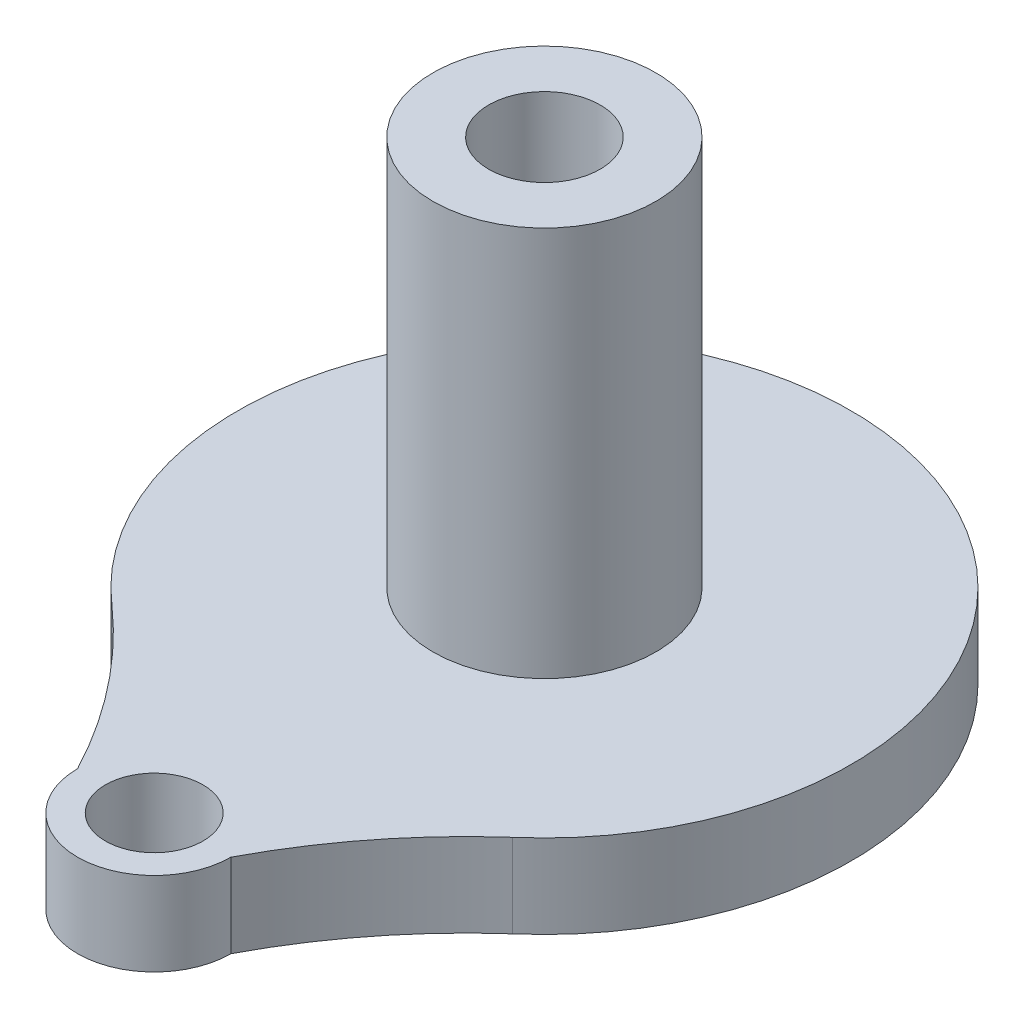
ISO-10303-21;
HEADER;
FILE_DESCRIPTION(('STEP AP214'),'2;1');
FILE_NAME('part.step','',(''),(''),'','','');
FILE_SCHEMA(('AUTOMOTIVE_DESIGN { 1 0 10303 214 1 1 1 1 }'));
ENDSEC;
DATA;
#1=APPLICATION_CONTEXT('core data for automotive mechanical design processes');
#2=APPLICATION_PROTOCOL_DEFINITION('international standard','automotive_design',2000,#1);
#3=PRODUCT_CONTEXT('',#1,'mechanical');
#4=PRODUCT('Part','Part','',(#3));
#5=PRODUCT_RELATED_PRODUCT_CATEGORY('part','',(#4));
#6=PRODUCT_DEFINITION_FORMATION('','',#4);
#7=PRODUCT_DEFINITION_CONTEXT('part definition',#1,'design');
#8=PRODUCT_DEFINITION('design','',#6,#7);
#9=PRODUCT_DEFINITION_SHAPE('','',#8);
#10=(LENGTH_UNIT() NAMED_UNIT(*) SI_UNIT(.MILLI.,.METRE.));
#11=(NAMED_UNIT(*) PLANE_ANGLE_UNIT() SI_UNIT($,.RADIAN.));
#12=(NAMED_UNIT(*) SI_UNIT($,.STERADIAN.) SOLID_ANGLE_UNIT());
#13=UNCERTAINTY_MEASURE_WITH_UNIT(LENGTH_MEASURE(1.E-05),#10,'distance_accuracy_value','');
#14=(GEOMETRIC_REPRESENTATION_CONTEXT(3) GLOBAL_UNCERTAINTY_ASSIGNED_CONTEXT((#13)) GLOBAL_UNIT_ASSIGNED_CONTEXT((#10,
#11,#12)) REPRESENTATION_CONTEXT('',''));
#15=CARTESIAN_POINT('',(0.,0.,0.));
#16=DIRECTION('',(0.,0.,1.));
#17=DIRECTION('',(1.,0.,0.));
#18=AXIS2_PLACEMENT_3D('',#15,#16,#17);
#19=CARTESIAN_POINT('',(0.,3.,0.));
#20=DIRECTION('',(0.,-1.,0.));
#21=DIRECTION('',(0.,0.,-1.));
#22=AXIS2_PLACEMENT_3D('',#19,#20,#21);
#23=CYLINDRICAL_SURFACE('',#22,11.);
#24=CARTESIAN_POINT('',(0.,0.,0.));
#25=DIRECTION('',(0.,1.,0.));
#26=DIRECTION('',(0.,0.,1.));
#27=AXIS2_PLACEMENT_3D('',#24,#25,#26);
#28=CIRCLE('',#27,11.);
#29=CARTESIAN_POINT('',(7.18573136738372,0.,8.3285811946452));
#30=VERTEX_POINT('',#29);
#31=CARTESIAN_POINT('',(-7.18573136738357,0.,8.32858119464533));
#32=VERTEX_POINT('',#31);
#33=EDGE_CURVE('E48',#30,#32,#28,.T.);
#34=ORIENTED_EDGE('',*,*,#33,.T.);
#35=DIRECTION('',(0.,-1.,0.));
#36=VECTOR('',#35,1.);
#37=CARTESIAN_POINT('',(-7.18573136738357,3.,8.32858119464533));
#38=LINE('',#37,#36);
#39=CARTESIAN_POINT('',(-7.18573136738357,3.,8.32858119464533));
#40=VERTEX_POINT('',#39);
#41=EDGE_CURVE('E61',#40,#32,#38,.T.);
#42=ORIENTED_EDGE('',*,*,#41,.F.);
#43=CARTESIAN_POINT('',(0.,3.,0.));
#44=DIRECTION('',(0.,1.,0.));
#45=DIRECTION('',(0.,0.,1.));
#46=AXIS2_PLACEMENT_3D('',#43,#44,#45);
#47=CIRCLE('',#46,11.);
#48=CARTESIAN_POINT('',(7.18573136738372,3.,8.3285811946452));
#49=VERTEX_POINT('',#48);
#50=EDGE_CURVE('E53',#49,#40,#47,.T.);
#51=ORIENTED_EDGE('',*,*,#50,.F.);
#52=DIRECTION('',(0.,-1.,0.));
#53=VECTOR('',#52,1.);
#54=CARTESIAN_POINT('',(7.18573136738372,3.,8.3285811946452));
#55=LINE('',#54,#53);
#56=EDGE_CURVE('E97',#49,#30,#55,.T.);
#57=ORIENTED_EDGE('',*,*,#56,.T.);
#58=EDGE_LOOP('',(#34,#42,#51,#57));
#59=FACE_BOUND('',#58,.T.);
#60=ADVANCED_FACE('F45',(#59),#23,.T.);
#61=CARTESIAN_POINT('',(0.,3.,0.));
#62=DIRECTION('',(0.,1.,0.));
#63=DIRECTION('',(0.,0.,1.));
#64=AXIS2_PLACEMENT_3D('',#61,#62,#63);
#65=PLANE('',#64);
#66=CARTESIAN_POINT('',(0.,3.,0.));
#67=DIRECTION('',(0.,1.,0.));
#68=DIRECTION('',(0.,0.,1.));
#69=AXIS2_PLACEMENT_3D('',#66,#67,#68);
#70=CIRCLE('',#69,4.);
#71=CARTESIAN_POINT('',(0.,3.,4.));
#72=VERTEX_POINT('',#71);
#73=EDGE_CURVE('E11',#72,#72,#70,.T.);
#74=ORIENTED_EDGE('',*,*,#73,.F.);
#75=EDGE_LOOP('',(#74));
#76=FACE_BOUND('',#75,.T.);
#77=ORIENTED_EDGE('',*,*,#50,.T.);
#78=CARTESIAN_POINT('',(-20.4643827973479,3.,23.2844300906962));
#79=DIRECTION('',(0.,-1.,0.));
#80=DIRECTION('',(0.,0.,-1.));
#81=AXIS2_PLACEMENT_3D('',#78,#79,#80);
#82=CIRCLE('',#81,20.);
#83=CARTESIAN_POINT('',(-2.75,3.,14.));
#84=VERTEX_POINT('',#83);
#85=EDGE_CURVE('E108',#84,#40,#82,.F.);
#86=ORIENTED_EDGE('',*,*,#85,.F.);
#87=CARTESIAN_POINT('',(0.,3.,14.));
#88=DIRECTION('',(0.,-1.,0.));
#89=DIRECTION('',(0.,0.,-1.));
#90=AXIS2_PLACEMENT_3D('',#87,#88,#89);
#91=CIRCLE('',#90,2.75);
#92=CARTESIAN_POINT('',(2.75,3.,14.));
#93=VERTEX_POINT('',#92);
#94=EDGE_CURVE('E89',#93,#84,#91,.T.);
#95=ORIENTED_EDGE('',*,*,#94,.F.);
#96=CARTESIAN_POINT('',(20.4643827973479,3.,23.2844300906962));
#97=DIRECTION('',(0.,-1.,0.));
#98=DIRECTION('',(0.,0.,-1.));
#99=AXIS2_PLACEMENT_3D('',#96,#97,#98);
#100=CIRCLE('',#99,20.);
#101=EDGE_CURVE('E100',#93,#49,#100,.T.);
#102=ORIENTED_EDGE('',*,*,#101,.T.);
#103=EDGE_LOOP('',(#77,#86,#95,#102));
#104=FACE_BOUND('',#103,.T.);
#105=CARTESIAN_POINT('',(0.,3.,14.));
#106=DIRECTION('',(0.,-1.,0.));
#107=DIRECTION('',(0.,0.,-1.));
#108=AXIS2_PLACEMENT_3D('',#105,#106,#107);
#109=CIRCLE('',#108,1.75);
#110=CARTESIAN_POINT('',(0.,3.,12.25));
#111=VERTEX_POINT('',#110);
#112=EDGE_CURVE('E110',#111,#111,#109,.T.);
#113=ORIENTED_EDGE('',*,*,#112,.T.);
#114=EDGE_LOOP('',(#113));
#115=FACE_BOUND('',#114,.T.);
#116=ADVANCED_FACE('F105',(#76,#104,#115),#65,.T.);
#117=CARTESIAN_POINT('',(0.,0.,0.));
#118=DIRECTION('',(0.,1.,0.));
#119=DIRECTION('',(0.,0.,1.));
#120=AXIS2_PLACEMENT_3D('',#117,#118,#119);
#121=PLANE('',#120);
#122=CARTESIAN_POINT('',(0.,0.,0.));
#123=DIRECTION('',(0.,1.,0.));
#124=DIRECTION('',(0.,0.,1.));
#125=AXIS2_PLACEMENT_3D('',#122,#123,#124);
#126=CIRCLE('',#125,2.);
#127=CARTESIAN_POINT('',(0.,0.,2.));
#128=VERTEX_POINT('',#127);
#129=EDGE_CURVE('E129',#128,#128,#126,.T.);
#130=ORIENTED_EDGE('',*,*,#129,.T.);
#131=EDGE_LOOP('',(#130));
#132=FACE_BOUND('',#131,.T.);
#133=ORIENTED_EDGE('',*,*,#33,.F.);
#134=CARTESIAN_POINT('',(20.4643827973479,0.,23.2844300906962));
#135=DIRECTION('',(0.,-1.,0.));
#136=DIRECTION('',(0.,0.,-1.));
#137=AXIS2_PLACEMENT_3D('',#134,#135,#136);
#138=CIRCLE('',#137,20.);
#139=CARTESIAN_POINT('',(2.75,0.,14.));
#140=VERTEX_POINT('',#139);
#141=EDGE_CURVE('E115',#140,#30,#138,.T.);
#142=ORIENTED_EDGE('',*,*,#141,.F.);
#143=CARTESIAN_POINT('',(0.,0.,14.));
#144=DIRECTION('',(0.,-1.,0.));
#145=DIRECTION('',(0.,0.,-1.));
#146=AXIS2_PLACEMENT_3D('',#143,#144,#145);
#147=CIRCLE('',#146,2.75);
#148=CARTESIAN_POINT('',(-2.75,0.,14.));
#149=VERTEX_POINT('',#148);
#150=EDGE_CURVE('E92',#140,#149,#147,.T.);
#151=ORIENTED_EDGE('',*,*,#150,.T.);
#152=CARTESIAN_POINT('',(-20.4643827973479,0.,23.2844300906962));
#153=DIRECTION('',(0.,-1.,0.));
#154=DIRECTION('',(0.,0.,-1.));
#155=AXIS2_PLACEMENT_3D('',#152,#153,#154);
#156=CIRCLE('',#155,20.);
#157=EDGE_CURVE('E118',#149,#32,#156,.F.);
#158=ORIENTED_EDGE('',*,*,#157,.T.);
#159=EDGE_LOOP('',(#133,#142,#151,#158));
#160=FACE_BOUND('',#159,.T.);
#161=CARTESIAN_POINT('',(0.,0.,14.));
#162=DIRECTION('',(0.,-1.,0.));
#163=DIRECTION('',(0.,0.,-1.));
#164=AXIS2_PLACEMENT_3D('',#161,#162,#163);
#165=CIRCLE('',#164,1.75);
#166=CARTESIAN_POINT('',(0.,0.,12.25));
#167=VERTEX_POINT('',#166);
#168=EDGE_CURVE('E103',#167,#167,#165,.T.);
#169=ORIENTED_EDGE('',*,*,#168,.F.);
#170=EDGE_LOOP('',(#169));
#171=FACE_BOUND('',#170,.T.);
#172=ADVANCED_FACE('F138',(#132,#160,#171),#121,.F.);
#173=CARTESIAN_POINT('',(0.,17.,0.));
#174=DIRECTION('',(0.,-1.,0.));
#175=DIRECTION('',(0.,0.,-1.));
#176=AXIS2_PLACEMENT_3D('',#173,#174,#175);
#177=CYLINDRICAL_SURFACE('',#176,4.);
#178=CARTESIAN_POINT('',(0.,17.,0.));
#179=DIRECTION('',(0.,1.,0.));
#180=DIRECTION('',(0.,0.,1.));
#181=AXIS2_PLACEMENT_3D('',#178,#179,#180);
#182=CIRCLE('',#181,4.);
#183=CARTESIAN_POINT('',(0.,17.,4.));
#184=VERTEX_POINT('',#183);
#185=EDGE_CURVE('E132',#184,#184,#182,.T.);
#186=ORIENTED_EDGE('',*,*,#185,.F.);
#187=EDGE_LOOP('',(#186));
#188=FACE_BOUND('',#187,.T.);
#189=ORIENTED_EDGE('',*,*,#73,.T.);
#190=EDGE_LOOP('',(#189));
#191=FACE_BOUND('',#190,.T.);
#192=ADVANCED_FACE('F141',(#188,#191),#177,.T.);
#193=CARTESIAN_POINT('',(0.,17.,0.));
#194=DIRECTION('',(0.,1.,0.));
#195=DIRECTION('',(0.,0.,1.));
#196=AXIS2_PLACEMENT_3D('',#193,#194,#195);
#197=PLANE('',#196);
#198=CARTESIAN_POINT('',(0.,17.,0.));
#199=DIRECTION('',(0.,1.,0.));
#200=DIRECTION('',(0.,0.,1.));
#201=AXIS2_PLACEMENT_3D('',#198,#199,#200);
#202=CIRCLE('',#201,2.);
#203=CARTESIAN_POINT('',(0.,17.,2.));
#204=VERTEX_POINT('',#203);
#205=EDGE_CURVE('E124',#204,#204,#202,.T.);
#206=ORIENTED_EDGE('',*,*,#205,.F.);
#207=EDGE_LOOP('',(#206));
#208=FACE_BOUND('',#207,.T.);
#209=ORIENTED_EDGE('',*,*,#185,.T.);
#210=EDGE_LOOP('',(#209));
#211=FACE_BOUND('',#210,.T.);
#212=ADVANCED_FACE('F168',(#208,#211),#197,.T.);
#213=CARTESIAN_POINT('',(0.,-3.,0.));
#214=DIRECTION('',(0.,1.,0.));
#215=DIRECTION('',(0.,0.,1.));
#216=AXIS2_PLACEMENT_3D('',#213,#214,#215);
#217=CYLINDRICAL_SURFACE('',#216,2.);
#218=ORIENTED_EDGE('',*,*,#205,.T.);
#219=EDGE_LOOP('',(#218));
#220=FACE_BOUND('',#219,.T.);
#221=ORIENTED_EDGE('',*,*,#129,.F.);
#222=EDGE_LOOP('',(#221));
#223=FACE_BOUND('',#222,.T.);
#224=ADVANCED_FACE('F172',(#220,#223),#217,.F.);
#225=CARTESIAN_POINT('',(-20.4643827973479,3.,23.2844300906962));
#226=DIRECTION('',(0.,-1.,0.));
#227=DIRECTION('',(0.,0.,-1.));
#228=AXIS2_PLACEMENT_3D('',#225,#226,#227);
#229=CYLINDRICAL_SURFACE('',#228,20.);
#230=ORIENTED_EDGE('',*,*,#157,.F.);
#231=DIRECTION('',(0.,-1.,0.));
#232=VECTOR('',#231,1.);
#233=CARTESIAN_POINT('',(-2.75,3.,14.));
#234=LINE('',#233,#232);
#235=EDGE_CURVE('E96',#84,#149,#234,.T.);
#236=ORIENTED_EDGE('',*,*,#235,.F.);
#237=ORIENTED_EDGE('',*,*,#85,.T.);
#238=ORIENTED_EDGE('',*,*,#41,.T.);
#239=EDGE_LOOP('',(#230,#236,#237,#238));
#240=FACE_BOUND('',#239,.T.);
#241=ADVANCED_FACE('F137',(#240),#229,.F.);
#242=CARTESIAN_POINT('',(0.,3.,14.));
#243=DIRECTION('',(0.,-1.,0.));
#244=DIRECTION('',(0.,0.,-1.));
#245=AXIS2_PLACEMENT_3D('',#242,#243,#244);
#246=CYLINDRICAL_SURFACE('',#245,2.75);
#247=ORIENTED_EDGE('',*,*,#150,.F.);
#248=DIRECTION('',(0.,-1.,0.));
#249=VECTOR('',#248,1.);
#250=CARTESIAN_POINT('',(2.75,3.,14.));
#251=LINE('',#250,#249);
#252=EDGE_CURVE('E85',#93,#140,#251,.T.);
#253=ORIENTED_EDGE('',*,*,#252,.F.);
#254=ORIENTED_EDGE('',*,*,#94,.T.);
#255=ORIENTED_EDGE('',*,*,#235,.T.);
#256=EDGE_LOOP('',(#247,#253,#254,#255));
#257=FACE_BOUND('',#256,.T.);
#258=ADVANCED_FACE('F87',(#257),#246,.T.);
#259=CARTESIAN_POINT('',(20.4643827973479,3.,23.2844300906962));
#260=DIRECTION('',(0.,-1.,0.));
#261=DIRECTION('',(0.,0.,-1.));
#262=AXIS2_PLACEMENT_3D('',#259,#260,#261);
#263=CYLINDRICAL_SURFACE('',#262,20.);
#264=ORIENTED_EDGE('',*,*,#141,.T.);
#265=ORIENTED_EDGE('',*,*,#56,.F.);
#266=ORIENTED_EDGE('',*,*,#101,.F.);
#267=ORIENTED_EDGE('',*,*,#252,.T.);
#268=EDGE_LOOP('',(#264,#265,#266,#267));
#269=FACE_BOUND('',#268,.T.);
#270=ADVANCED_FACE('F101',(#269),#263,.F.);
#271=CARTESIAN_POINT('',(0.,3.,14.));
#272=DIRECTION('',(0.,-1.,0.));
#273=DIRECTION('',(0.,0.,-1.));
#274=AXIS2_PLACEMENT_3D('',#271,#272,#273);
#275=CYLINDRICAL_SURFACE('',#274,1.75);
#276=ORIENTED_EDGE('',*,*,#112,.F.);
#277=EDGE_LOOP('',(#276));
#278=FACE_BOUND('',#277,.T.);
#279=ORIENTED_EDGE('',*,*,#168,.T.);
#280=EDGE_LOOP('',(#279));
#281=FACE_BOUND('',#280,.T.);
#282=ADVANCED_FACE('F145',(#278,#281),#275,.F.);
#283=CLOSED_SHELL('',(#60,#116,#172,#192,#212,#224,#241,#258,#270,#282));
#284=MANIFOLD_SOLID_BREP('B2',#283);
#285=ADVANCED_BREP_SHAPE_REPRESENTATION('',(#18,#284),#14);
#286=SHAPE_DEFINITION_REPRESENTATION(#9,#285);
ENDSEC;
END-ISO-10303-21;
